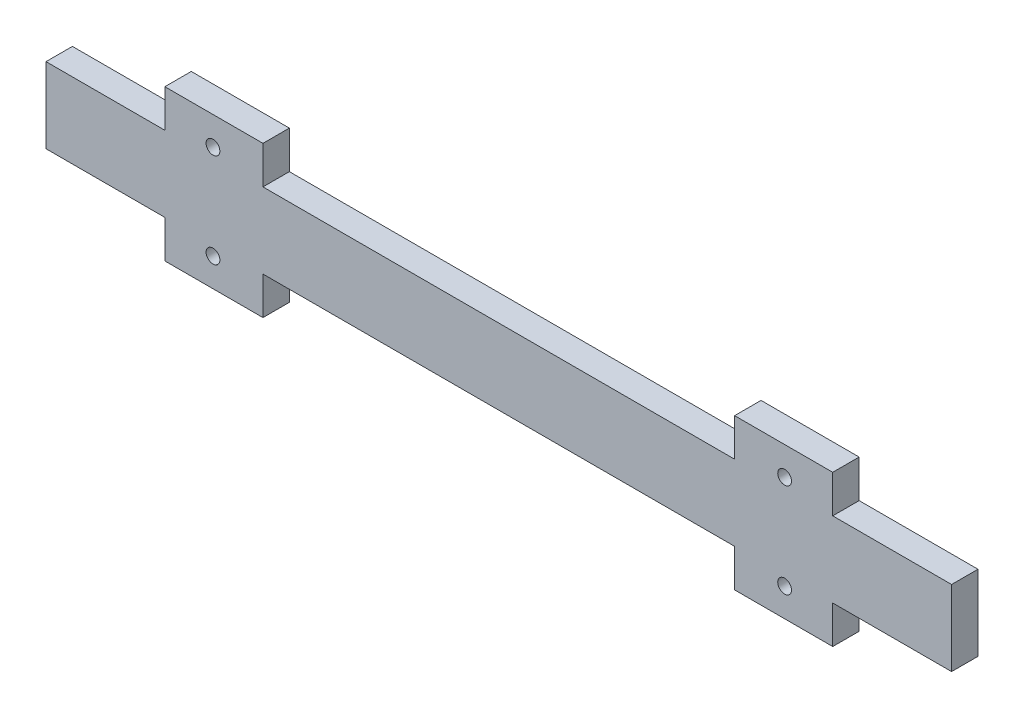
ISO-10303-21;
HEADER;
FILE_DESCRIPTION(('STEP AP214'),'2;1');
FILE_NAME('part.step','',(''),(''),'','','');
FILE_SCHEMA(('AUTOMOTIVE_DESIGN { 1 0 10303 214 1 1 1 1 }'));
ENDSEC;
DATA;
#1=APPLICATION_CONTEXT('core data for automotive mechanical design processes');
#2=APPLICATION_PROTOCOL_DEFINITION('international standard','automotive_design',2000,#1);
#3=PRODUCT_CONTEXT('',#1,'mechanical');
#4=PRODUCT('Part','Part','',(#3));
#5=PRODUCT_RELATED_PRODUCT_CATEGORY('part','',(#4));
#6=PRODUCT_DEFINITION_FORMATION('','',#4);
#7=PRODUCT_DEFINITION_CONTEXT('part definition',#1,'design');
#8=PRODUCT_DEFINITION('design','',#6,#7);
#9=PRODUCT_DEFINITION_SHAPE('','',#8);
#10=(LENGTH_UNIT() NAMED_UNIT(*) SI_UNIT(.MILLI.,.METRE.));
#11=(NAMED_UNIT(*) PLANE_ANGLE_UNIT() SI_UNIT($,.RADIAN.));
#12=(NAMED_UNIT(*) SI_UNIT($,.STERADIAN.) SOLID_ANGLE_UNIT());
#13=UNCERTAINTY_MEASURE_WITH_UNIT(LENGTH_MEASURE(1.E-05),#10,'distance_accuracy_value','');
#14=(GEOMETRIC_REPRESENTATION_CONTEXT(3) GLOBAL_UNCERTAINTY_ASSIGNED_CONTEXT((#13)) GLOBAL_UNIT_ASSIGNED_CONTEXT((#10,
#11,#12)) REPRESENTATION_CONTEXT('',''));
#15=CARTESIAN_POINT('',(0.,0.,0.));
#16=DIRECTION('',(0.,0.,1.));
#17=DIRECTION('',(1.,0.,0.));
#18=AXIS2_PLACEMENT_3D('',#15,#16,#17);
#19=CARTESIAN_POINT('',(-56.9681367927398,20.,14.));
#20=DIRECTION('',(0.,-1.,0.));
#21=DIRECTION('',(0.,0.,-1.));
#22=AXIS2_PLACEMENT_3D('',#19,#20,#21);
#23=PLANE('',#22);
#24=DIRECTION('',(-1.,0.,0.));
#25=VECTOR('',#24,1.);
#26=CARTESIAN_POINT('',(-56.9681367927398,20.,0.));
#27=LINE('',#26,#25);
#28=CARTESIAN_POINT('',(6.0318632072602,20.,0.));
#29=VERTEX_POINT('',#28);
#30=CARTESIAN_POINT('',(-56.9681367927398,20.,0.));
#31=VERTEX_POINT('',#30);
#32=EDGE_CURVE('E200',#29,#31,#27,.T.);
#33=ORIENTED_EDGE('',*,*,#32,.T.);
#34=DIRECTION('',(0.,0.,-1.));
#35=VECTOR('',#34,1.);
#36=CARTESIAN_POINT('',(-56.9681367927398,20.,14.));
#37=LINE('',#36,#35);
#38=CARTESIAN_POINT('',(-56.9681367927398,20.,14.));
#39=VERTEX_POINT('',#38);
#40=EDGE_CURVE('E11',#39,#31,#37,.T.);
#41=ORIENTED_EDGE('',*,*,#40,.F.);
#42=DIRECTION('',(-1.,0.,0.));
#43=VECTOR('',#42,1.);
#44=CARTESIAN_POINT('',(-56.9681367927398,20.,14.));
#45=LINE('',#44,#43);
#46=CARTESIAN_POINT('',(6.0318632072602,20.,14.));
#47=VERTEX_POINT('',#46);
#48=EDGE_CURVE('E239',#47,#39,#45,.T.);
#49=ORIENTED_EDGE('',*,*,#48,.F.);
#50=DIRECTION('',(0.,0.,-1.));
#51=VECTOR('',#50,1.);
#52=CARTESIAN_POINT('',(6.0318632072602,20.,14.));
#53=LINE('',#52,#51);
#54=EDGE_CURVE('E196',#47,#29,#53,.T.);
#55=ORIENTED_EDGE('',*,*,#54,.T.);
#56=EDGE_LOOP('',(#33,#41,#49,#55));
#57=FACE_BOUND('',#56,.T.);
#58=ADVANCED_FACE('F32',(#57),#23,.F.);
#59=CARTESIAN_POINT('',(-56.9681367927398,-20.,14.));
#60=DIRECTION('',(1.,0.,0.));
#61=DIRECTION('',(0.,0.,-1.));
#62=AXIS2_PLACEMENT_3D('',#59,#60,#61);
#63=PLANE('',#62);
#64=DIRECTION('',(0.,-1.,0.));
#65=VECTOR('',#64,1.);
#66=CARTESIAN_POINT('',(-56.9681367927398,-20.,0.));
#67=LINE('',#66,#65);
#68=CARTESIAN_POINT('',(-56.9681367927398,-20.,0.));
#69=VERTEX_POINT('',#68);
#70=EDGE_CURVE('E203',#31,#69,#67,.T.);
#71=ORIENTED_EDGE('',*,*,#70,.T.);
#72=DIRECTION('',(0.,0.,-1.));
#73=VECTOR('',#72,1.);
#74=CARTESIAN_POINT('',(-56.9681367927398,-20.,14.));
#75=LINE('',#74,#73);
#76=CARTESIAN_POINT('',(-56.9681367927398,-20.,14.));
#77=VERTEX_POINT('',#76);
#78=EDGE_CURVE('E40',#77,#69,#75,.T.);
#79=ORIENTED_EDGE('',*,*,#78,.F.);
#80=DIRECTION('',(0.,-1.,0.));
#81=VECTOR('',#80,1.);
#82=CARTESIAN_POINT('',(-56.9681367927398,-20.,14.));
#83=LINE('',#82,#81);
#84=EDGE_CURVE('E127',#39,#77,#83,.T.);
#85=ORIENTED_EDGE('',*,*,#84,.F.);
#86=ORIENTED_EDGE('',*,*,#40,.T.);
#87=EDGE_LOOP('',(#71,#79,#85,#86));
#88=FACE_BOUND('',#87,.T.);
#89=ADVANCED_FACE('F358',(#88),#63,.F.);
#90=CARTESIAN_POINT('',(-56.9681367927398,-20.,14.));
#91=DIRECTION('',(0.,1.,0.));
#92=DIRECTION('',(0.,0.,1.));
#93=AXIS2_PLACEMENT_3D('',#90,#91,#92);
#94=PLANE('',#93);
#95=DIRECTION('',(1.,0.,0.));
#96=VECTOR('',#95,1.);
#97=CARTESIAN_POINT('',(-56.9681367927398,-20.,0.));
#98=LINE('',#97,#96);
#99=CARTESIAN_POINT('',(6.0318632072602,-20.,0.));
#100=VERTEX_POINT('',#99);
#101=EDGE_CURVE('E206',#69,#100,#98,.T.);
#102=ORIENTED_EDGE('',*,*,#101,.T.);
#103=DIRECTION('',(0.,0.,-1.));
#104=VECTOR('',#103,1.);
#105=CARTESIAN_POINT('',(6.0318632072602,-20.,14.));
#106=LINE('',#105,#104);
#107=CARTESIAN_POINT('',(6.0318632072602,-20.,14.));
#108=VERTEX_POINT('',#107);
#109=EDGE_CURVE('E282',#108,#100,#106,.T.);
#110=ORIENTED_EDGE('',*,*,#109,.F.);
#111=DIRECTION('',(1.,0.,0.));
#112=VECTOR('',#111,1.);
#113=CARTESIAN_POINT('',(-56.9681367927398,-20.,14.));
#114=LINE('',#113,#112);
#115=EDGE_CURVE('E290',#77,#108,#114,.T.);
#116=ORIENTED_EDGE('',*,*,#115,.F.);
#117=ORIENTED_EDGE('',*,*,#78,.T.);
#118=EDGE_LOOP('',(#102,#110,#116,#117));
#119=FACE_BOUND('',#118,.T.);
#120=ADVANCED_FACE('F288',(#119),#94,.F.);
#121=CARTESIAN_POINT('',(6.0318632072602,-20.,14.));
#122=DIRECTION('',(1.,0.,0.));
#123=DIRECTION('',(0.,0.,-1.));
#124=AXIS2_PLACEMENT_3D('',#121,#122,#123);
#125=PLANE('',#124);
#126=DIRECTION('',(0.,-1.,0.));
#127=VECTOR('',#126,1.);
#128=CARTESIAN_POINT('',(6.0318632072602,-20.,0.));
#129=LINE('',#128,#127);
#130=CARTESIAN_POINT('',(6.0318632072602,-40.,0.));
#131=VERTEX_POINT('',#130);
#132=EDGE_CURVE('E208',#100,#131,#129,.T.);
#133=ORIENTED_EDGE('',*,*,#132,.T.);
#134=DIRECTION('',(0.,0.,-1.));
#135=VECTOR('',#134,1.);
#136=CARTESIAN_POINT('',(6.0318632072602,-40.,14.));
#137=LINE('',#136,#135);
#138=CARTESIAN_POINT('',(6.0318632072602,-40.,14.));
#139=VERTEX_POINT('',#138);
#140=EDGE_CURVE('E279',#139,#131,#137,.T.);
#141=ORIENTED_EDGE('',*,*,#140,.F.);
#142=DIRECTION('',(0.,-1.,0.));
#143=VECTOR('',#142,1.);
#144=CARTESIAN_POINT('',(6.0318632072602,-20.,14.));
#145=LINE('',#144,#143);
#146=EDGE_CURVE('E308',#108,#139,#145,.T.);
#147=ORIENTED_EDGE('',*,*,#146,.F.);
#148=ORIENTED_EDGE('',*,*,#109,.T.);
#149=EDGE_LOOP('',(#133,#141,#147,#148));
#150=FACE_BOUND('',#149,.T.);
#151=ADVANCED_FACE('F299',(#150),#125,.F.);
#152=CARTESIAN_POINT('',(6.0318632072602,-40.,14.));
#153=DIRECTION('',(0.,1.,0.));
#154=DIRECTION('',(0.,0.,1.));
#155=AXIS2_PLACEMENT_3D('',#152,#153,#154);
#156=PLANE('',#155);
#157=DIRECTION('',(1.,0.,0.));
#158=VECTOR('',#157,1.);
#159=CARTESIAN_POINT('',(6.0318632072602,-40.,0.));
#160=LINE('',#159,#158);
#161=CARTESIAN_POINT('',(58.0318632072602,-40.,0.));
#162=VERTEX_POINT('',#161);
#163=EDGE_CURVE('E210',#131,#162,#160,.T.);
#164=ORIENTED_EDGE('',*,*,#163,.T.);
#165=DIRECTION('',(0.,0.,-1.));
#166=VECTOR('',#165,1.);
#167=CARTESIAN_POINT('',(58.0318632072602,-40.,14.));
#168=LINE('',#167,#166);
#169=CARTESIAN_POINT('',(58.0318632072602,-40.,14.));
#170=VERTEX_POINT('',#169);
#171=EDGE_CURVE('E276',#170,#162,#168,.T.);
#172=ORIENTED_EDGE('',*,*,#171,.F.);
#173=DIRECTION('',(1.,0.,0.));
#174=VECTOR('',#173,1.);
#175=CARTESIAN_POINT('',(6.0318632072602,-40.,14.));
#176=LINE('',#175,#174);
#177=EDGE_CURVE('E305',#139,#170,#176,.T.);
#178=ORIENTED_EDGE('',*,*,#177,.F.);
#179=ORIENTED_EDGE('',*,*,#140,.T.);
#180=EDGE_LOOP('',(#164,#172,#178,#179));
#181=FACE_BOUND('',#180,.T.);
#182=ADVANCED_FACE('F303',(#181),#156,.F.);
#183=CARTESIAN_POINT('',(58.0318632072602,-40.,14.));
#184=DIRECTION('',(-1.,0.,0.));
#185=DIRECTION('',(0.,0.,1.));
#186=AXIS2_PLACEMENT_3D('',#183,#184,#185);
#187=PLANE('',#186);
#188=DIRECTION('',(0.,1.,0.));
#189=VECTOR('',#188,1.);
#190=CARTESIAN_POINT('',(58.0318632072602,-40.,0.));
#191=LINE('',#190,#189);
#192=CARTESIAN_POINT('',(58.0318632072602,-20.,0.));
#193=VERTEX_POINT('',#192);
#194=EDGE_CURVE('E212',#162,#193,#191,.T.);
#195=ORIENTED_EDGE('',*,*,#194,.T.);
#196=DIRECTION('',(0.,0.,-1.));
#197=VECTOR('',#196,1.);
#198=CARTESIAN_POINT('',(58.0318632072602,-20.,14.));
#199=LINE('',#198,#197);
#200=CARTESIAN_POINT('',(58.0318632072602,-20.,14.));
#201=VERTEX_POINT('',#200);
#202=EDGE_CURVE('E273',#201,#193,#199,.T.);
#203=ORIENTED_EDGE('',*,*,#202,.F.);
#204=DIRECTION('',(0.,1.,0.));
#205=VECTOR('',#204,1.);
#206=CARTESIAN_POINT('',(58.0318632072602,-40.,14.));
#207=LINE('',#206,#205);
#208=EDGE_CURVE('E307',#170,#201,#207,.T.);
#209=ORIENTED_EDGE('',*,*,#208,.F.);
#210=ORIENTED_EDGE('',*,*,#171,.T.);
#211=EDGE_LOOP('',(#195,#203,#209,#210));
#212=FACE_BOUND('',#211,.T.);
#213=ADVANCED_FACE('F371',(#212),#187,.F.);
#214=CARTESIAN_POINT('',(58.0318632072602,-20.,14.));
#215=DIRECTION('',(0.,1.,0.));
#216=DIRECTION('',(0.,0.,1.));
#217=AXIS2_PLACEMENT_3D('',#214,#215,#216);
#218=PLANE('',#217);
#219=DIRECTION('',(1.,0.,0.));
#220=VECTOR('',#219,1.);
#221=CARTESIAN_POINT('',(58.0318632072602,-20.,0.));
#222=LINE('',#221,#220);
#223=CARTESIAN_POINT('',(308.03186320726,-20.,0.));
#224=VERTEX_POINT('',#223);
#225=EDGE_CURVE('E214',#193,#224,#222,.T.);
#226=ORIENTED_EDGE('',*,*,#225,.T.);
#227=DIRECTION('',(0.,0.,-1.));
#228=VECTOR('',#227,1.);
#229=CARTESIAN_POINT('',(308.03186320726,-20.,14.));
#230=LINE('',#229,#228);
#231=CARTESIAN_POINT('',(308.03186320726,-20.,14.));
#232=VERTEX_POINT('',#231);
#233=EDGE_CURVE('E270',#232,#224,#230,.T.);
#234=ORIENTED_EDGE('',*,*,#233,.F.);
#235=DIRECTION('',(1.,0.,0.));
#236=VECTOR('',#235,1.);
#237=CARTESIAN_POINT('',(58.0318632072602,-20.,14.));
#238=LINE('',#237,#236);
#239=EDGE_CURVE('E310',#201,#232,#238,.T.);
#240=ORIENTED_EDGE('',*,*,#239,.F.);
#241=ORIENTED_EDGE('',*,*,#202,.T.);
#242=EDGE_LOOP('',(#226,#234,#240,#241));
#243=FACE_BOUND('',#242,.T.);
#244=ADVANCED_FACE('F374',(#243),#218,.F.);
#245=CARTESIAN_POINT('',(308.03186320726,-20.,14.));
#246=DIRECTION('',(1.,0.,0.));
#247=DIRECTION('',(0.,0.,-1.));
#248=AXIS2_PLACEMENT_3D('',#245,#246,#247);
#249=PLANE('',#248);
#250=DIRECTION('',(0.,-1.,0.));
#251=VECTOR('',#250,1.);
#252=CARTESIAN_POINT('',(308.03186320726,-20.,0.));
#253=LINE('',#252,#251);
#254=CARTESIAN_POINT('',(308.03186320726,-40.,0.));
#255=VERTEX_POINT('',#254);
#256=EDGE_CURVE('E216',#224,#255,#253,.T.);
#257=ORIENTED_EDGE('',*,*,#256,.T.);
#258=DIRECTION('',(0.,0.,-1.));
#259=VECTOR('',#258,1.);
#260=CARTESIAN_POINT('',(308.03186320726,-40.,14.));
#261=LINE('',#260,#259);
#262=CARTESIAN_POINT('',(308.03186320726,-40.,14.));
#263=VERTEX_POINT('',#262);
#264=EDGE_CURVE('E267',#263,#255,#261,.T.);
#265=ORIENTED_EDGE('',*,*,#264,.F.);
#266=DIRECTION('',(0.,-1.,0.));
#267=VECTOR('',#266,1.);
#268=CARTESIAN_POINT('',(308.03186320726,-20.,14.));
#269=LINE('',#268,#267);
#270=EDGE_CURVE('E316',#232,#263,#269,.T.);
#271=ORIENTED_EDGE('',*,*,#270,.F.);
#272=ORIENTED_EDGE('',*,*,#233,.T.);
#273=EDGE_LOOP('',(#257,#265,#271,#272));
#274=FACE_BOUND('',#273,.T.);
#275=ADVANCED_FACE('F378',(#274),#249,.F.);
#276=CARTESIAN_POINT('',(308.03186320726,-40.,14.));
#277=DIRECTION('',(0.,1.,0.));
#278=DIRECTION('',(-1.,0.,0.));
#279=AXIS2_PLACEMENT_3D('',#276,#277,#278);
#280=PLANE('',#279);
#281=DIRECTION('',(1.,0.,0.));
#282=VECTOR('',#281,1.);
#283=CARTESIAN_POINT('',(308.03186320726,-40.,0.));
#284=LINE('',#283,#282);
#285=CARTESIAN_POINT('',(360.03186320726,-40.,0.));
#286=VERTEX_POINT('',#285);
#287=EDGE_CURVE('E218',#255,#286,#284,.T.);
#288=ORIENTED_EDGE('',*,*,#287,.T.);
#289=DIRECTION('',(0.,0.,-1.));
#290=VECTOR('',#289,1.);
#291=CARTESIAN_POINT('',(360.03186320726,-40.,14.));
#292=LINE('',#291,#290);
#293=CARTESIAN_POINT('',(360.03186320726,-40.,14.));
#294=VERTEX_POINT('',#293);
#295=EDGE_CURVE('E264',#294,#286,#292,.T.);
#296=ORIENTED_EDGE('',*,*,#295,.F.);
#297=DIRECTION('',(1.,0.,0.));
#298=VECTOR('',#297,1.);
#299=CARTESIAN_POINT('',(308.03186320726,-40.,14.));
#300=LINE('',#299,#298);
#301=EDGE_CURVE('E318',#263,#294,#300,.T.);
#302=ORIENTED_EDGE('',*,*,#301,.F.);
#303=ORIENTED_EDGE('',*,*,#264,.T.);
#304=EDGE_LOOP('',(#288,#296,#302,#303));
#305=FACE_BOUND('',#304,.T.);
#306=ADVANCED_FACE('F382',(#305),#280,.F.);
#307=CARTESIAN_POINT('',(360.03186320726,-40.,14.));
#308=DIRECTION('',(-1.,0.,0.));
#309=DIRECTION('',(0.,0.,1.));
#310=AXIS2_PLACEMENT_3D('',#307,#308,#309);
#311=PLANE('',#310);
#312=DIRECTION('',(0.,1.,0.));
#313=VECTOR('',#312,1.);
#314=CARTESIAN_POINT('',(360.03186320726,-40.,0.));
#315=LINE('',#314,#313);
#316=CARTESIAN_POINT('',(360.03186320726,-20.,0.));
#317=VERTEX_POINT('',#316);
#318=EDGE_CURVE('E220',#286,#317,#315,.T.);
#319=ORIENTED_EDGE('',*,*,#318,.T.);
#320=DIRECTION('',(0.,0.,-1.));
#321=VECTOR('',#320,1.);
#322=CARTESIAN_POINT('',(360.03186320726,-20.,14.));
#323=LINE('',#322,#321);
#324=CARTESIAN_POINT('',(360.03186320726,-20.,14.));
#325=VERTEX_POINT('',#324);
#326=EDGE_CURVE('E261',#325,#317,#323,.T.);
#327=ORIENTED_EDGE('',*,*,#326,.F.);
#328=DIRECTION('',(0.,1.,0.));
#329=VECTOR('',#328,1.);
#330=CARTESIAN_POINT('',(360.03186320726,-40.,14.));
#331=LINE('',#330,#329);
#332=EDGE_CURVE('E320',#294,#325,#331,.T.);
#333=ORIENTED_EDGE('',*,*,#332,.F.);
#334=ORIENTED_EDGE('',*,*,#295,.T.);
#335=EDGE_LOOP('',(#319,#327,#333,#334));
#336=FACE_BOUND('',#335,.T.);
#337=ADVANCED_FACE('F386',(#336),#311,.F.);
#338=CARTESIAN_POINT('',(360.03186320726,-20.,14.));
#339=DIRECTION('',(0.,1.,0.));
#340=DIRECTION('',(-1.,0.,0.));
#341=AXIS2_PLACEMENT_3D('',#338,#339,#340);
#342=PLANE('',#341);
#343=DIRECTION('',(1.,0.,0.));
#344=VECTOR('',#343,1.);
#345=CARTESIAN_POINT('',(360.03186320726,-20.,0.));
#346=LINE('',#345,#344);
#347=CARTESIAN_POINT('',(423.03186320726,-20.,0.));
#348=VERTEX_POINT('',#347);
#349=EDGE_CURVE('E222',#317,#348,#346,.T.);
#350=ORIENTED_EDGE('',*,*,#349,.T.);
#351=DIRECTION('',(0.,0.,-1.));
#352=VECTOR('',#351,1.);
#353=CARTESIAN_POINT('',(423.03186320726,-20.,14.));
#354=LINE('',#353,#352);
#355=CARTESIAN_POINT('',(423.03186320726,-20.,14.));
#356=VERTEX_POINT('',#355);
#357=EDGE_CURVE('E258',#356,#348,#354,.T.);
#358=ORIENTED_EDGE('',*,*,#357,.F.);
#359=DIRECTION('',(1.,0.,0.));
#360=VECTOR('',#359,1.);
#361=CARTESIAN_POINT('',(360.03186320726,-20.,14.));
#362=LINE('',#361,#360);
#363=EDGE_CURVE('E322',#325,#356,#362,.T.);
#364=ORIENTED_EDGE('',*,*,#363,.F.);
#365=ORIENTED_EDGE('',*,*,#326,.T.);
#366=EDGE_LOOP('',(#350,#358,#364,#365));
#367=FACE_BOUND('',#366,.T.);
#368=ADVANCED_FACE('F390',(#367),#342,.F.);
#369=CARTESIAN_POINT('',(423.03186320726,20.,14.));
#370=DIRECTION('',(-1.,0.,0.));
#371=DIRECTION('',(0.,0.,1.));
#372=AXIS2_PLACEMENT_3D('',#369,#370,#371);
#373=PLANE('',#372);
#374=DIRECTION('',(0.,1.,0.));
#375=VECTOR('',#374,1.);
#376=CARTESIAN_POINT('',(423.03186320726,20.,0.));
#377=LINE('',#376,#375);
#378=CARTESIAN_POINT('',(423.03186320726,20.,0.));
#379=VERTEX_POINT('',#378);
#380=EDGE_CURVE('E224',#348,#379,#377,.T.);
#381=ORIENTED_EDGE('',*,*,#380,.T.);
#382=DIRECTION('',(0.,0.,-1.));
#383=VECTOR('',#382,1.);
#384=CARTESIAN_POINT('',(423.03186320726,20.,14.));
#385=LINE('',#384,#383);
#386=CARTESIAN_POINT('',(423.03186320726,20.,14.));
#387=VERTEX_POINT('',#386);
#388=EDGE_CURVE('E255',#387,#379,#385,.T.);
#389=ORIENTED_EDGE('',*,*,#388,.F.);
#390=DIRECTION('',(0.,1.,0.));
#391=VECTOR('',#390,1.);
#392=CARTESIAN_POINT('',(423.03186320726,20.,14.));
#393=LINE('',#392,#391);
#394=EDGE_CURVE('E324',#356,#387,#393,.T.);
#395=ORIENTED_EDGE('',*,*,#394,.F.);
#396=ORIENTED_EDGE('',*,*,#357,.T.);
#397=EDGE_LOOP('',(#381,#389,#395,#396));
#398=FACE_BOUND('',#397,.T.);
#399=ADVANCED_FACE('F394',(#398),#373,.F.);
#400=CARTESIAN_POINT('',(360.03186320726,20.,14.));
#401=DIRECTION('',(0.,-1.,0.));
#402=DIRECTION('',(1.,0.,0.));
#403=AXIS2_PLACEMENT_3D('',#400,#401,#402);
#404=PLANE('',#403);
#405=DIRECTION('',(-1.,0.,0.));
#406=VECTOR('',#405,1.);
#407=CARTESIAN_POINT('',(360.03186320726,20.,0.));
#408=LINE('',#407,#406);
#409=CARTESIAN_POINT('',(360.03186320726,20.,0.));
#410=VERTEX_POINT('',#409);
#411=EDGE_CURVE('E226',#379,#410,#408,.T.);
#412=ORIENTED_EDGE('',*,*,#411,.T.);
#413=DIRECTION('',(0.,0.,-1.));
#414=VECTOR('',#413,1.);
#415=CARTESIAN_POINT('',(360.03186320726,20.,14.));
#416=LINE('',#415,#414);
#417=CARTESIAN_POINT('',(360.03186320726,20.,14.));
#418=VERTEX_POINT('',#417);
#419=EDGE_CURVE('E252',#418,#410,#416,.T.);
#420=ORIENTED_EDGE('',*,*,#419,.F.);
#421=DIRECTION('',(-1.,0.,0.));
#422=VECTOR('',#421,1.);
#423=CARTESIAN_POINT('',(360.03186320726,20.,14.));
#424=LINE('',#423,#422);
#425=EDGE_CURVE('E326',#387,#418,#424,.T.);
#426=ORIENTED_EDGE('',*,*,#425,.F.);
#427=ORIENTED_EDGE('',*,*,#388,.T.);
#428=EDGE_LOOP('',(#412,#420,#426,#427));
#429=FACE_BOUND('',#428,.T.);
#430=ADVANCED_FACE('F398',(#429),#404,.F.);
#431=CARTESIAN_POINT('',(360.03186320726,40.,14.));
#432=DIRECTION('',(-1.,0.,0.));
#433=DIRECTION('',(0.,0.,1.));
#434=AXIS2_PLACEMENT_3D('',#431,#432,#433);
#435=PLANE('',#434);
#436=DIRECTION('',(0.,1.,0.));
#437=VECTOR('',#436,1.);
#438=CARTESIAN_POINT('',(360.03186320726,40.,0.));
#439=LINE('',#438,#437);
#440=CARTESIAN_POINT('',(360.03186320726,40.,0.));
#441=VERTEX_POINT('',#440);
#442=EDGE_CURVE('E228',#410,#441,#439,.T.);
#443=ORIENTED_EDGE('',*,*,#442,.T.);
#444=DIRECTION('',(0.,0.,-1.));
#445=VECTOR('',#444,1.);
#446=CARTESIAN_POINT('',(360.03186320726,40.,14.));
#447=LINE('',#446,#445);
#448=CARTESIAN_POINT('',(360.03186320726,40.,14.));
#449=VERTEX_POINT('',#448);
#450=EDGE_CURVE('E249',#449,#441,#447,.T.);
#451=ORIENTED_EDGE('',*,*,#450,.F.);
#452=DIRECTION('',(0.,1.,0.));
#453=VECTOR('',#452,1.);
#454=CARTESIAN_POINT('',(360.03186320726,40.,14.));
#455=LINE('',#454,#453);
#456=EDGE_CURVE('E328',#418,#449,#455,.T.);
#457=ORIENTED_EDGE('',*,*,#456,.F.);
#458=ORIENTED_EDGE('',*,*,#419,.T.);
#459=EDGE_LOOP('',(#443,#451,#457,#458));
#460=FACE_BOUND('',#459,.T.);
#461=ADVANCED_FACE('F402',(#460),#435,.F.);
#462=CARTESIAN_POINT('',(308.03186320726,40.,14.));
#463=DIRECTION('',(0.,-1.,0.));
#464=DIRECTION('',(1.,0.,0.));
#465=AXIS2_PLACEMENT_3D('',#462,#463,#464);
#466=PLANE('',#465);
#467=DIRECTION('',(-1.,0.,0.));
#468=VECTOR('',#467,1.);
#469=CARTESIAN_POINT('',(308.03186320726,40.,0.));
#470=LINE('',#469,#468);
#471=CARTESIAN_POINT('',(308.03186320726,40.,0.));
#472=VERTEX_POINT('',#471);
#473=EDGE_CURVE('E230',#441,#472,#470,.T.);
#474=ORIENTED_EDGE('',*,*,#473,.T.);
#475=DIRECTION('',(0.,0.,-1.));
#476=VECTOR('',#475,1.);
#477=CARTESIAN_POINT('',(308.03186320726,40.,14.));
#478=LINE('',#477,#476);
#479=CARTESIAN_POINT('',(308.03186320726,40.,14.));
#480=VERTEX_POINT('',#479);
#481=EDGE_CURVE('E246',#480,#472,#478,.T.);
#482=ORIENTED_EDGE('',*,*,#481,.F.);
#483=DIRECTION('',(-1.,0.,0.));
#484=VECTOR('',#483,1.);
#485=CARTESIAN_POINT('',(308.03186320726,40.,14.));
#486=LINE('',#485,#484);
#487=EDGE_CURVE('E330',#449,#480,#486,.T.);
#488=ORIENTED_EDGE('',*,*,#487,.F.);
#489=ORIENTED_EDGE('',*,*,#450,.T.);
#490=EDGE_LOOP('',(#474,#482,#488,#489));
#491=FACE_BOUND('',#490,.T.);
#492=ADVANCED_FACE('F406',(#491),#466,.F.);
#493=CARTESIAN_POINT('',(308.03186320726,20.,14.));
#494=DIRECTION('',(1.,0.,0.));
#495=DIRECTION('',(0.,0.,-1.));
#496=AXIS2_PLACEMENT_3D('',#493,#494,#495);
#497=PLANE('',#496);
#498=DIRECTION('',(0.,-1.,0.));
#499=VECTOR('',#498,1.);
#500=CARTESIAN_POINT('',(308.03186320726,20.,0.));
#501=LINE('',#500,#499);
#502=CARTESIAN_POINT('',(308.03186320726,20.,0.));
#503=VERTEX_POINT('',#502);
#504=EDGE_CURVE('E232',#472,#503,#501,.T.);
#505=ORIENTED_EDGE('',*,*,#504,.T.);
#506=DIRECTION('',(0.,0.,-1.));
#507=VECTOR('',#506,1.);
#508=CARTESIAN_POINT('',(308.03186320726,20.,14.));
#509=LINE('',#508,#507);
#510=CARTESIAN_POINT('',(308.03186320726,20.,14.));
#511=VERTEX_POINT('',#510);
#512=EDGE_CURVE('E243',#511,#503,#509,.T.);
#513=ORIENTED_EDGE('',*,*,#512,.F.);
#514=DIRECTION('',(0.,-1.,0.));
#515=VECTOR('',#514,1.);
#516=CARTESIAN_POINT('',(308.03186320726,20.,14.));
#517=LINE('',#516,#515);
#518=EDGE_CURVE('E332',#480,#511,#517,.T.);
#519=ORIENTED_EDGE('',*,*,#518,.F.);
#520=ORIENTED_EDGE('',*,*,#481,.T.);
#521=EDGE_LOOP('',(#505,#513,#519,#520));
#522=FACE_BOUND('',#521,.T.);
#523=ADVANCED_FACE('F338',(#522),#497,.F.);
#524=CARTESIAN_POINT('',(58.0318632072602,20.,14.));
#525=DIRECTION('',(0.,-1.,0.));
#526=DIRECTION('',(0.,0.,-1.));
#527=AXIS2_PLACEMENT_3D('',#524,#525,#526);
#528=PLANE('',#527);
#529=DIRECTION('',(-1.,0.,0.));
#530=VECTOR('',#529,1.);
#531=CARTESIAN_POINT('',(58.0318632072602,20.,0.));
#532=LINE('',#531,#530);
#533=CARTESIAN_POINT('',(58.0318632072602,20.,0.));
#534=VERTEX_POINT('',#533);
#535=EDGE_CURVE('E234',#503,#534,#532,.T.);
#536=ORIENTED_EDGE('',*,*,#535,.T.);
#537=DIRECTION('',(0.,0.,-1.));
#538=VECTOR('',#537,1.);
#539=CARTESIAN_POINT('',(58.0318632072602,20.,14.));
#540=LINE('',#539,#538);
#541=CARTESIAN_POINT('',(58.0318632072602,20.,14.));
#542=VERTEX_POINT('',#541);
#543=EDGE_CURVE('E191',#542,#534,#540,.T.);
#544=ORIENTED_EDGE('',*,*,#543,.F.);
#545=DIRECTION('',(-1.,0.,0.));
#546=VECTOR('',#545,1.);
#547=CARTESIAN_POINT('',(58.0318632072602,20.,14.));
#548=LINE('',#547,#546);
#549=EDGE_CURVE('E182',#511,#542,#548,.T.);
#550=ORIENTED_EDGE('',*,*,#549,.F.);
#551=ORIENTED_EDGE('',*,*,#512,.T.);
#552=EDGE_LOOP('',(#536,#544,#550,#551));
#553=FACE_BOUND('',#552,.T.);
#554=ADVANCED_FACE('F342',(#553),#528,.F.);
#555=CARTESIAN_POINT('',(58.0318632072602,40.,14.));
#556=DIRECTION('',(-1.,0.,0.));
#557=DIRECTION('',(0.,0.,1.));
#558=AXIS2_PLACEMENT_3D('',#555,#556,#557);
#559=PLANE('',#558);
#560=DIRECTION('',(0.,1.,0.));
#561=VECTOR('',#560,1.);
#562=CARTESIAN_POINT('',(58.0318632072602,40.,0.));
#563=LINE('',#562,#561);
#564=CARTESIAN_POINT('',(58.0318632072602,40.,0.));
#565=VERTEX_POINT('',#564);
#566=EDGE_CURVE('E190',#534,#565,#563,.T.);
#567=ORIENTED_EDGE('',*,*,#566,.T.);
#568=DIRECTION('',(0.,0.,-1.));
#569=VECTOR('',#568,1.);
#570=CARTESIAN_POINT('',(58.0318632072602,40.,14.));
#571=LINE('',#570,#569);
#572=CARTESIAN_POINT('',(58.0318632072602,40.,14.));
#573=VERTEX_POINT('',#572);
#574=EDGE_CURVE('E187',#573,#565,#571,.T.);
#575=ORIENTED_EDGE('',*,*,#574,.F.);
#576=DIRECTION('',(0.,1.,0.));
#577=VECTOR('',#576,1.);
#578=CARTESIAN_POINT('',(58.0318632072602,40.,14.));
#579=LINE('',#578,#577);
#580=EDGE_CURVE('E176',#542,#573,#579,.T.);
#581=ORIENTED_EDGE('',*,*,#580,.F.);
#582=ORIENTED_EDGE('',*,*,#543,.T.);
#583=EDGE_LOOP('',(#567,#575,#581,#582));
#584=FACE_BOUND('',#583,.T.);
#585=ADVANCED_FACE('F188',(#584),#559,.F.);
#586=CARTESIAN_POINT('',(6.0318632072602,40.,14.));
#587=DIRECTION('',(0.,-1.,0.));
#588=DIRECTION('',(0.,0.,-1.));
#589=AXIS2_PLACEMENT_3D('',#586,#587,#588);
#590=PLANE('',#589);
#591=DIRECTION('',(-1.,0.,0.));
#592=VECTOR('',#591,1.);
#593=CARTESIAN_POINT('',(6.0318632072602,40.,0.));
#594=LINE('',#593,#592);
#595=CARTESIAN_POINT('',(6.0318632072602,40.,0.));
#596=VERTEX_POINT('',#595);
#597=EDGE_CURVE('E113',#565,#596,#594,.T.);
#598=ORIENTED_EDGE('',*,*,#597,.T.);
#599=DIRECTION('',(0.,0.,-1.));
#600=VECTOR('',#599,1.);
#601=CARTESIAN_POINT('',(6.0318632072602,40.,14.));
#602=LINE('',#601,#600);
#603=CARTESIAN_POINT('',(6.0318632072602,40.,14.));
#604=VERTEX_POINT('',#603);
#605=EDGE_CURVE('E192',#604,#596,#602,.T.);
#606=ORIENTED_EDGE('',*,*,#605,.F.);
#607=DIRECTION('',(-1.,0.,0.));
#608=VECTOR('',#607,1.);
#609=CARTESIAN_POINT('',(6.0318632072602,40.,14.));
#610=LINE('',#609,#608);
#611=EDGE_CURVE('E180',#573,#604,#610,.T.);
#612=ORIENTED_EDGE('',*,*,#611,.F.);
#613=ORIENTED_EDGE('',*,*,#574,.T.);
#614=EDGE_LOOP('',(#598,#606,#612,#613));
#615=FACE_BOUND('',#614,.T.);
#616=ADVANCED_FACE('F194',(#615),#590,.F.);
#617=CARTESIAN_POINT('',(6.0318632072602,20.,14.));
#618=DIRECTION('',(1.,0.,0.));
#619=DIRECTION('',(0.,0.,-1.));
#620=AXIS2_PLACEMENT_3D('',#617,#618,#619);
#621=PLANE('',#620);
#622=DIRECTION('',(0.,-1.,0.));
#623=VECTOR('',#622,1.);
#624=CARTESIAN_POINT('',(6.0318632072602,20.,0.));
#625=LINE('',#624,#623);
#626=EDGE_CURVE('E119',#596,#29,#625,.T.);
#627=ORIENTED_EDGE('',*,*,#626,.T.);
#628=ORIENTED_EDGE('',*,*,#54,.F.);
#629=DIRECTION('',(0.,-1.,0.));
#630=VECTOR('',#629,1.);
#631=CARTESIAN_POINT('',(6.0318632072602,20.,14.));
#632=LINE('',#631,#630);
#633=EDGE_CURVE('E48',#604,#47,#632,.T.);
#634=ORIENTED_EDGE('',*,*,#633,.F.);
#635=ORIENTED_EDGE('',*,*,#605,.T.);
#636=EDGE_LOOP('',(#627,#628,#634,#635));
#637=FACE_BOUND('',#636,.T.);
#638=ADVANCED_FACE('F346',(#637),#621,.F.);
#639=CARTESIAN_POINT('',(0.,0.,14.));
#640=DIRECTION('',(0.,0.,1.));
#641=DIRECTION('',(1.,0.,0.));
#642=AXIS2_PLACEMENT_3D('',#639,#640,#641);
#643=PLANE('',#642);
#644=CARTESIAN_POINT('',(334.53186320726,25.,14.));
#645=DIRECTION('',(0.,0.,1.));
#646=DIRECTION('',(-1.,0.,0.));
#647=AXIS2_PLACEMENT_3D('',#644,#645,#646);
#648=CIRCLE('',#647,3.65000000000004);
#649=CARTESIAN_POINT('',(330.88186320726,25.,14.));
#650=VERTEX_POINT('',#649);
#651=EDGE_CURVE('E492',#650,#650,#648,.T.);
#652=ORIENTED_EDGE('',*,*,#651,.F.);
#653=EDGE_LOOP('',(#652));
#654=FACE_BOUND('',#653,.T.);
#655=CARTESIAN_POINT('',(334.53186320726,-25.,14.));
#656=DIRECTION('',(0.,0.,1.));
#657=DIRECTION('',(1.,0.,0.));
#658=AXIS2_PLACEMENT_3D('',#655,#656,#657);
#659=CIRCLE('',#658,3.65000000000004);
#660=CARTESIAN_POINT('',(338.18186320726,-25.,14.));
#661=VERTEX_POINT('',#660);
#662=EDGE_CURVE('E494',#661,#661,#659,.T.);
#663=ORIENTED_EDGE('',*,*,#662,.F.);
#664=EDGE_LOOP('',(#663));
#665=FACE_BOUND('',#664,.T.);
#666=CARTESIAN_POINT('',(31.5318632072602,-25.,14.));
#667=DIRECTION('',(0.,0.,1.));
#668=DIRECTION('',(-1.,0.,0.));
#669=AXIS2_PLACEMENT_3D('',#666,#667,#668);
#670=CIRCLE('',#669,3.65);
#671=CARTESIAN_POINT('',(27.8818632072602,-25.,14.));
#672=VERTEX_POINT('',#671);
#673=EDGE_CURVE('E508',#672,#672,#670,.T.);
#674=ORIENTED_EDGE('',*,*,#673,.F.);
#675=EDGE_LOOP('',(#674));
#676=FACE_BOUND('',#675,.T.);
#677=CARTESIAN_POINT('',(31.5318632072602,25.,14.));
#678=DIRECTION('',(0.,0.,1.));
#679=DIRECTION('',(1.,0.,0.));
#680=AXIS2_PLACEMENT_3D('',#677,#678,#679);
#681=CIRCLE('',#680,3.65);
#682=CARTESIAN_POINT('',(35.1818632072602,25.,14.));
#683=VERTEX_POINT('',#682);
#684=EDGE_CURVE('E500',#683,#683,#681,.T.);
#685=ORIENTED_EDGE('',*,*,#684,.F.);
#686=EDGE_LOOP('',(#685));
#687=FACE_BOUND('',#686,.T.);
#688=ORIENTED_EDGE('',*,*,#48,.T.);
#689=ORIENTED_EDGE('',*,*,#84,.T.);
#690=ORIENTED_EDGE('',*,*,#115,.T.);
#691=ORIENTED_EDGE('',*,*,#146,.T.);
#692=ORIENTED_EDGE('',*,*,#177,.T.);
#693=ORIENTED_EDGE('',*,*,#208,.T.);
#694=ORIENTED_EDGE('',*,*,#239,.T.);
#695=ORIENTED_EDGE('',*,*,#270,.T.);
#696=ORIENTED_EDGE('',*,*,#301,.T.);
#697=ORIENTED_EDGE('',*,*,#332,.T.);
#698=ORIENTED_EDGE('',*,*,#363,.T.);
#699=ORIENTED_EDGE('',*,*,#394,.T.);
#700=ORIENTED_EDGE('',*,*,#425,.T.);
#701=ORIENTED_EDGE('',*,*,#456,.T.);
#702=ORIENTED_EDGE('',*,*,#487,.T.);
#703=ORIENTED_EDGE('',*,*,#518,.T.);
#704=ORIENTED_EDGE('',*,*,#549,.T.);
#705=ORIENTED_EDGE('',*,*,#580,.T.);
#706=ORIENTED_EDGE('',*,*,#611,.T.);
#707=ORIENTED_EDGE('',*,*,#633,.T.);
#708=EDGE_LOOP('',(#688,#689,#690,#691,#692,#693,#694,#695,#696,#697,#698,#699,#700,#701,#702,
#703,#704,#705,#706,#707));
#709=FACE_BOUND('',#708,.T.);
#710=ADVANCED_FACE('F178',(#654,#665,#676,#687,#709),#643,.T.);
#711=CARTESIAN_POINT('',(0.,0.,0.));
#712=DIRECTION('',(0.,0.,1.));
#713=DIRECTION('',(1.,0.,0.));
#714=AXIS2_PLACEMENT_3D('',#711,#712,#713);
#715=PLANE('',#714);
#716=CARTESIAN_POINT('',(334.53186320726,25.,0.));
#717=DIRECTION('',(0.,0.,1.));
#718=DIRECTION('',(-1.,0.,0.));
#719=AXIS2_PLACEMENT_3D('',#716,#717,#718);
#720=CIRCLE('',#719,3.65000000000004);
#721=CARTESIAN_POINT('',(330.88186320726,25.,0.));
#722=VERTEX_POINT('',#721);
#723=EDGE_CURVE('E489',#722,#722,#720,.T.);
#724=ORIENTED_EDGE('',*,*,#723,.T.);
#725=EDGE_LOOP('',(#724));
#726=FACE_BOUND('',#725,.T.);
#727=CARTESIAN_POINT('',(334.53186320726,-25.,0.));
#728=DIRECTION('',(0.,0.,1.));
#729=DIRECTION('',(1.,0.,0.));
#730=AXIS2_PLACEMENT_3D('',#727,#728,#729);
#731=CIRCLE('',#730,3.65000000000004);
#732=CARTESIAN_POINT('',(338.18186320726,-25.,0.));
#733=VERTEX_POINT('',#732);
#734=EDGE_CURVE('E513',#733,#733,#731,.T.);
#735=ORIENTED_EDGE('',*,*,#734,.T.);
#736=EDGE_LOOP('',(#735));
#737=FACE_BOUND('',#736,.T.);
#738=CARTESIAN_POINT('',(31.5318632072602,-25.,0.));
#739=DIRECTION('',(0.,0.,1.));
#740=DIRECTION('',(-1.,0.,0.));
#741=AXIS2_PLACEMENT_3D('',#738,#739,#740);
#742=CIRCLE('',#741,3.65);
#743=CARTESIAN_POINT('',(27.8818632072602,-25.,0.));
#744=VERTEX_POINT('',#743);
#745=EDGE_CURVE('E503',#744,#744,#742,.T.);
#746=ORIENTED_EDGE('',*,*,#745,.T.);
#747=EDGE_LOOP('',(#746));
#748=FACE_BOUND('',#747,.T.);
#749=CARTESIAN_POINT('',(31.5318632072602,25.,0.));
#750=DIRECTION('',(0.,0.,1.));
#751=DIRECTION('',(1.,0.,0.));
#752=AXIS2_PLACEMENT_3D('',#749,#750,#751);
#753=CIRCLE('',#752,3.65);
#754=CARTESIAN_POINT('',(35.1818632072602,25.,0.));
#755=VERTEX_POINT('',#754);
#756=EDGE_CURVE('E204',#755,#755,#753,.T.);
#757=ORIENTED_EDGE('',*,*,#756,.T.);
#758=EDGE_LOOP('',(#757));
#759=FACE_BOUND('',#758,.T.);
#760=ORIENTED_EDGE('',*,*,#32,.F.);
#761=ORIENTED_EDGE('',*,*,#626,.F.);
#762=ORIENTED_EDGE('',*,*,#597,.F.);
#763=ORIENTED_EDGE('',*,*,#566,.F.);
#764=ORIENTED_EDGE('',*,*,#535,.F.);
#765=ORIENTED_EDGE('',*,*,#504,.F.);
#766=ORIENTED_EDGE('',*,*,#473,.F.);
#767=ORIENTED_EDGE('',*,*,#442,.F.);
#768=ORIENTED_EDGE('',*,*,#411,.F.);
#769=ORIENTED_EDGE('',*,*,#380,.F.);
#770=ORIENTED_EDGE('',*,*,#349,.F.);
#771=ORIENTED_EDGE('',*,*,#318,.F.);
#772=ORIENTED_EDGE('',*,*,#287,.F.);
#773=ORIENTED_EDGE('',*,*,#256,.F.);
#774=ORIENTED_EDGE('',*,*,#225,.F.);
#775=ORIENTED_EDGE('',*,*,#194,.F.);
#776=ORIENTED_EDGE('',*,*,#163,.F.);
#777=ORIENTED_EDGE('',*,*,#132,.F.);
#778=ORIENTED_EDGE('',*,*,#101,.F.);
#779=ORIENTED_EDGE('',*,*,#70,.F.);
#780=EDGE_LOOP('',(#760,#761,#762,#763,#764,#765,#766,#767,#768,#769,#770,#771,#772,#773,#774,
#775,#776,#777,#778,#779));
#781=FACE_BOUND('',#780,.T.);
#782=ADVANCED_FACE('F294',(#726,#737,#748,#759,#781),#715,.F.);
#783=CARTESIAN_POINT('',(31.5318632072602,25.,0.));
#784=DIRECTION('',(0.,0.,1.));
#785=DIRECTION('',(1.,0.,0.));
#786=AXIS2_PLACEMENT_3D('',#783,#784,#785);
#787=CYLINDRICAL_SURFACE('',#786,3.65);
#788=ORIENTED_EDGE('',*,*,#756,.F.);
#789=EDGE_LOOP('',(#788));
#790=FACE_BOUND('',#789,.T.);
#791=ORIENTED_EDGE('',*,*,#684,.T.);
#792=EDGE_LOOP('',(#791));
#793=FACE_BOUND('',#792,.T.);
#794=ADVANCED_FACE('F443',(#790,#793),#787,.F.);
#795=CARTESIAN_POINT('',(31.5318632072602,-25.,0.));
#796=DIRECTION('',(0.,0.,1.));
#797=DIRECTION('',(1.,0.,0.));
#798=AXIS2_PLACEMENT_3D('',#795,#796,#797);
#799=CYLINDRICAL_SURFACE('',#798,3.65);
#800=ORIENTED_EDGE('',*,*,#745,.F.);
#801=EDGE_LOOP('',(#800));
#802=FACE_BOUND('',#801,.T.);
#803=ORIENTED_EDGE('',*,*,#673,.T.);
#804=EDGE_LOOP('',(#803));
#805=FACE_BOUND('',#804,.T.);
#806=ADVANCED_FACE('F452',(#802,#805),#799,.F.);
#807=CARTESIAN_POINT('',(334.53186320726,-25.,0.));
#808=DIRECTION('',(0.,0.,1.));
#809=DIRECTION('',(1.,0.,0.));
#810=AXIS2_PLACEMENT_3D('',#807,#808,#809);
#811=CYLINDRICAL_SURFACE('',#810,3.65000000000004);
#812=ORIENTED_EDGE('',*,*,#734,.F.);
#813=EDGE_LOOP('',(#812));
#814=FACE_BOUND('',#813,.T.);
#815=ORIENTED_EDGE('',*,*,#662,.T.);
#816=EDGE_LOOP('',(#815));
#817=FACE_BOUND('',#816,.T.);
#818=ADVANCED_FACE('F462',(#814,#817),#811,.F.);
#819=CARTESIAN_POINT('',(334.53186320726,25.,0.));
#820=DIRECTION('',(0.,0.,1.));
#821=DIRECTION('',(1.,0.,0.));
#822=AXIS2_PLACEMENT_3D('',#819,#820,#821);
#823=CYLINDRICAL_SURFACE('',#822,3.65000000000004);
#824=ORIENTED_EDGE('',*,*,#723,.F.);
#825=EDGE_LOOP('',(#824));
#826=FACE_BOUND('',#825,.T.);
#827=ORIENTED_EDGE('',*,*,#651,.T.);
#828=EDGE_LOOP('',(#827));
#829=FACE_BOUND('',#828,.T.);
#830=ADVANCED_FACE('F472',(#826,#829),#823,.F.);
#831=CLOSED_SHELL('',(#58,#89,#120,#151,#182,#213,#244,#275,#306,#337,#368,#399,#430,#461,#492,
#523,#554,#585,#616,#638,#710,#782,#794,#806,#818,#830));
#832=MANIFOLD_SOLID_BREP('B2',#831);
#833=ADVANCED_BREP_SHAPE_REPRESENTATION('',(#18,#832),#14);
#834=SHAPE_DEFINITION_REPRESENTATION(#9,#833);
ENDSEC;
END-ISO-10303-21;
